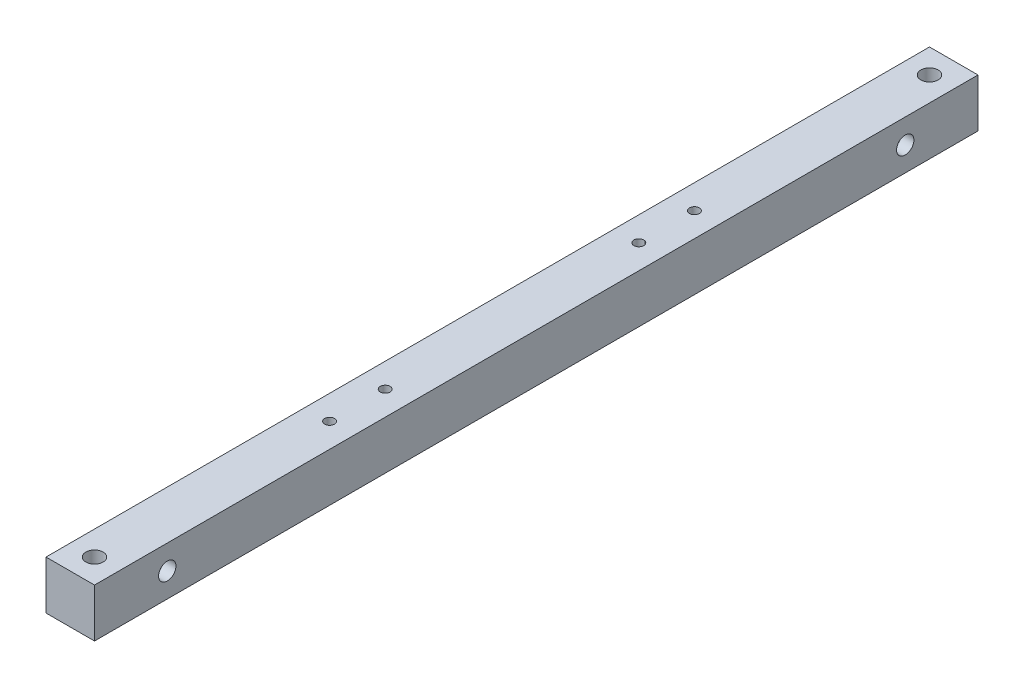
ISO-10303-21;
HEADER;
FILE_DESCRIPTION(('STEP AP214'),'2;1');
FILE_NAME('part.step','',(''),(''),'','','');
FILE_SCHEMA(('AUTOMOTIVE_DESIGN { 1 0 10303 214 1 1 1 1 }'));
ENDSEC;
DATA;
#1=APPLICATION_CONTEXT('core data for automotive mechanical design processes');
#2=APPLICATION_PROTOCOL_DEFINITION('international standard','automotive_design',2000,#1);
#3=PRODUCT_CONTEXT('',#1,'mechanical');
#4=PRODUCT('Part','Part','',(#3));
#5=PRODUCT_RELATED_PRODUCT_CATEGORY('part','',(#4));
#6=PRODUCT_DEFINITION_FORMATION('','',#4);
#7=PRODUCT_DEFINITION_CONTEXT('part definition',#1,'design');
#8=PRODUCT_DEFINITION('design','',#6,#7);
#9=PRODUCT_DEFINITION_SHAPE('','',#8);
#10=(LENGTH_UNIT() NAMED_UNIT(*) SI_UNIT(.MILLI.,.METRE.));
#11=(NAMED_UNIT(*) PLANE_ANGLE_UNIT() SI_UNIT($,.RADIAN.));
#12=(NAMED_UNIT(*) SI_UNIT($,.STERADIAN.) SOLID_ANGLE_UNIT());
#13=UNCERTAINTY_MEASURE_WITH_UNIT(LENGTH_MEASURE(1.E-05),#10,'distance_accuracy_value','');
#14=(GEOMETRIC_REPRESENTATION_CONTEXT(3) GLOBAL_UNCERTAINTY_ASSIGNED_CONTEXT((#13)) GLOBAL_UNIT_ASSIGNED_CONTEXT((#10,
#11,#12)) REPRESENTATION_CONTEXT('',''));
#15=CARTESIAN_POINT('',(0.,0.,0.));
#16=DIRECTION('',(0.,0.,1.));
#17=DIRECTION('',(1.,0.,0.));
#18=AXIS2_PLACEMENT_3D('',#15,#16,#17);
#19=CARTESIAN_POINT('',(0.,14.001,241.));
#20=DIRECTION('',(0.,-1.,0.));
#21=DIRECTION('',(0.,0.,-1.));
#22=AXIS2_PLACEMENT_3D('',#19,#20,#21);
#23=CYLINDRICAL_SURFACE('',#22,3.);
#24=CARTESIAN_POINT('',(0.,-14.,241.));
#25=DIRECTION('',(0.,-1.,0.));
#26=DIRECTION('',(0.,0.,-1.));
#27=AXIS2_PLACEMENT_3D('',#24,#25,#26);
#28=CIRCLE('',#27,3.);
#29=CARTESIAN_POINT('',(0.,-14.,238.));
#30=VERTEX_POINT('',#29);
#31=EDGE_CURVE('E122',#30,#30,#28,.T.);
#32=ORIENTED_EDGE('',*,*,#31,.T.);
#33=EDGE_LOOP('',(#32));
#34=FACE_BOUND('',#33,.T.);
#35=CARTESIAN_POINT('',(0.,7.,241.));
#36=DIRECTION('',(0.,1.,0.));
#37=DIRECTION('',(0.,0.,1.));
#38=AXIS2_PLACEMENT_3D('',#35,#36,#37);
#39=CIRCLE('',#38,3.);
#40=CARTESIAN_POINT('',(0.,7.,244.));
#41=VERTEX_POINT('',#40);
#42=EDGE_CURVE('E37',#41,#41,#39,.F.);
#43=ORIENTED_EDGE('',*,*,#42,.F.);
#44=EDGE_LOOP('',(#43));
#45=FACE_BOUND('',#44,.T.);
#46=ADVANCED_FACE('F33',(#34,#45),#23,.F.);
#47=CARTESIAN_POINT('',(0.,14.001,-241.));
#48=DIRECTION('',(0.,-1.,0.));
#49=DIRECTION('',(0.,0.,-1.));
#50=AXIS2_PLACEMENT_3D('',#47,#48,#49);
#51=CYLINDRICAL_SURFACE('',#50,3.);
#52=CARTESIAN_POINT('',(0.,-14.,-241.));
#53=DIRECTION('',(0.,-1.,0.));
#54=DIRECTION('',(0.,0.,-1.));
#55=AXIS2_PLACEMENT_3D('',#52,#53,#54);
#56=CIRCLE('',#55,3.);
#57=CARTESIAN_POINT('',(0.,-14.,-244.));
#58=VERTEX_POINT('',#57);
#59=EDGE_CURVE('E141',#58,#58,#56,.T.);
#60=ORIENTED_EDGE('',*,*,#59,.T.);
#61=EDGE_LOOP('',(#60));
#62=FACE_BOUND('',#61,.T.);
#63=CARTESIAN_POINT('',(0.,7.,-241.));
#64=DIRECTION('',(0.,1.,0.));
#65=DIRECTION('',(0.,0.,1.));
#66=AXIS2_PLACEMENT_3D('',#63,#64,#65);
#67=CIRCLE('',#66,3.);
#68=CARTESIAN_POINT('',(0.,7.,-238.));
#69=VERTEX_POINT('',#68);
#70=EDGE_CURVE('E116',#69,#69,#67,.F.);
#71=ORIENTED_EDGE('',*,*,#70,.F.);
#72=EDGE_LOOP('',(#71));
#73=FACE_BOUND('',#72,.T.);
#74=ADVANCED_FACE('F166',(#62,#73),#51,.F.);
#75=CARTESIAN_POINT('',(14.,-14.,255.));
#76=DIRECTION('',(-1.,0.,0.));
#77=DIRECTION('',(0.,0.,1.));
#78=AXIS2_PLACEMENT_3D('',#75,#76,#77);
#79=PLANE('',#78);
#80=CARTESIAN_POINT('',(14.,0.,213.));
#81=DIRECTION('',(1.,0.,0.));
#82=DIRECTION('',(0.,0.,-1.));
#83=AXIS2_PLACEMENT_3D('',#80,#81,#82);
#84=CIRCLE('',#83,5.00000000000005);
#85=CARTESIAN_POINT('',(14.,0.,208.));
#86=VERTEX_POINT('',#85);
#87=EDGE_CURVE('E153',#86,#86,#84,.T.);
#88=ORIENTED_EDGE('',*,*,#87,.F.);
#89=EDGE_LOOP('',(#88));
#90=FACE_BOUND('',#89,.T.);
#91=CARTESIAN_POINT('',(14.,0.,-213.));
#92=DIRECTION('',(1.,0.,0.));
#93=DIRECTION('',(0.,0.,-1.));
#94=AXIS2_PLACEMENT_3D('',#91,#92,#93);
#95=CIRCLE('',#94,4.99999999999999);
#96=CARTESIAN_POINT('',(14.,0.,-218.));
#97=VERTEX_POINT('',#96);
#98=EDGE_CURVE('E115',#97,#97,#95,.T.);
#99=ORIENTED_EDGE('',*,*,#98,.F.);
#100=EDGE_LOOP('',(#99));
#101=FACE_BOUND('',#100,.T.);
#102=DIRECTION('',(0.,1.,0.));
#103=VECTOR('',#102,1.);
#104=CARTESIAN_POINT('',(14.,-14.,-255.));
#105=LINE('',#104,#103);
#106=CARTESIAN_POINT('',(14.,-14.,-255.));
#107=VERTEX_POINT('',#106);
#108=CARTESIAN_POINT('',(14.,14.,-255.));
#109=VERTEX_POINT('',#108);
#110=EDGE_CURVE('E100',#107,#109,#105,.T.);
#111=ORIENTED_EDGE('',*,*,#110,.T.);
#112=DIRECTION('',(0.,0.,-1.));
#113=VECTOR('',#112,1.);
#114=CARTESIAN_POINT('',(14.,14.,255.));
#115=LINE('',#114,#113);
#116=CARTESIAN_POINT('',(14.,14.,255.));
#117=VERTEX_POINT('',#116);
#118=EDGE_CURVE('E11',#117,#109,#115,.T.);
#119=ORIENTED_EDGE('',*,*,#118,.F.);
#120=DIRECTION('',(0.,1.,0.));
#121=VECTOR('',#120,1.);
#122=CARTESIAN_POINT('',(14.,-14.,255.));
#123=LINE('',#122,#121);
#124=CARTESIAN_POINT('',(14.,-14.,255.));
#125=VERTEX_POINT('',#124);
#126=EDGE_CURVE('E87',#125,#117,#123,.T.);
#127=ORIENTED_EDGE('',*,*,#126,.F.);
#128=DIRECTION('',(0.,0.,-1.));
#129=VECTOR('',#128,1.);
#130=CARTESIAN_POINT('',(14.,-14.,255.));
#131=LINE('',#130,#129);
#132=EDGE_CURVE('E96',#125,#107,#131,.T.);
#133=ORIENTED_EDGE('',*,*,#132,.T.);
#134=EDGE_LOOP('',(#111,#119,#127,#133));
#135=FACE_BOUND('',#134,.T.);
#136=ADVANCED_FACE('F35',(#90,#101,#135),#79,.F.);
#137=CARTESIAN_POINT('',(-14.,14.,255.));
#138=DIRECTION('',(0.,-1.,0.));
#139=DIRECTION('',(0.,0.,-1.));
#140=AXIS2_PLACEMENT_3D('',#137,#138,#139);
#141=PLANE('',#140);
#142=CARTESIAN_POINT('',(0.,14.,105.3));
#143=DIRECTION('',(0.,1.,0.));
#144=DIRECTION('',(0.,0.,1.));
#145=AXIS2_PLACEMENT_3D('',#142,#143,#144);
#146=CIRCLE('',#145,2.85);
#147=CARTESIAN_POINT('',(0.,14.,108.15));
#148=VERTEX_POINT('',#147);
#149=EDGE_CURVE('E237',#148,#148,#146,.T.);
#150=ORIENTED_EDGE('',*,*,#149,.F.);
#151=EDGE_LOOP('',(#150));
#152=FACE_BOUND('',#151,.T.);
#153=CARTESIAN_POINT('',(0.,14.,73.2));
#154=DIRECTION('',(0.,1.,0.));
#155=DIRECTION('',(0.,0.,1.));
#156=AXIS2_PLACEMENT_3D('',#153,#154,#155);
#157=CIRCLE('',#156,2.85);
#158=CARTESIAN_POINT('',(0.,14.,76.05));
#159=VERTEX_POINT('',#158);
#160=EDGE_CURVE('E241',#159,#159,#157,.T.);
#161=ORIENTED_EDGE('',*,*,#160,.F.);
#162=EDGE_LOOP('',(#161));
#163=FACE_BOUND('',#162,.T.);
#164=CARTESIAN_POINT('',(0.,14.,-73.2));
#165=DIRECTION('',(0.,1.,0.));
#166=DIRECTION('',(0.,0.,-1.));
#167=AXIS2_PLACEMENT_3D('',#164,#165,#166);
#168=CIRCLE('',#167,2.85);
#169=CARTESIAN_POINT('',(0.,14.,-76.05));
#170=VERTEX_POINT('',#169);
#171=EDGE_CURVE('E245',#170,#170,#168,.T.);
#172=ORIENTED_EDGE('',*,*,#171,.F.);
#173=EDGE_LOOP('',(#172));
#174=FACE_BOUND('',#173,.T.);
#175=CARTESIAN_POINT('',(0.,14.,-105.3));
#176=DIRECTION('',(0.,1.,0.));
#177=DIRECTION('',(0.,0.,-1.));
#178=AXIS2_PLACEMENT_3D('',#175,#176,#177);
#179=CIRCLE('',#178,2.85);
#180=CARTESIAN_POINT('',(0.,14.,-108.15));
#181=VERTEX_POINT('',#180);
#182=EDGE_CURVE('E132',#181,#181,#179,.T.);
#183=ORIENTED_EDGE('',*,*,#182,.F.);
#184=EDGE_LOOP('',(#183));
#185=FACE_BOUND('',#184,.T.);
#186=CARTESIAN_POINT('',(0.,14.,241.));
#187=DIRECTION('',(0.,1.,0.));
#188=DIRECTION('',(0.,0.,1.));
#189=AXIS2_PLACEMENT_3D('',#186,#187,#188);
#190=CIRCLE('',#189,5.00000000000001);
#191=CARTESIAN_POINT('',(0.,14.,246.));
#192=VERTEX_POINT('',#191);
#193=EDGE_CURVE('E124',#192,#192,#190,.T.);
#194=ORIENTED_EDGE('',*,*,#193,.F.);
#195=EDGE_LOOP('',(#194));
#196=FACE_BOUND('',#195,.T.);
#197=CARTESIAN_POINT('',(0.,14.,-241.));
#198=DIRECTION('',(0.,1.,0.));
#199=DIRECTION('',(0.,0.,1.));
#200=AXIS2_PLACEMENT_3D('',#197,#198,#199);
#201=CIRCLE('',#200,5.00000000000001);
#202=CARTESIAN_POINT('',(0.,14.,-236.));
#203=VERTEX_POINT('',#202);
#204=EDGE_CURVE('E137',#203,#203,#201,.T.);
#205=ORIENTED_EDGE('',*,*,#204,.F.);
#206=EDGE_LOOP('',(#205));
#207=FACE_BOUND('',#206,.T.);
#208=DIRECTION('',(-1.,0.,0.));
#209=VECTOR('',#208,1.);
#210=CARTESIAN_POINT('',(-14.,14.,-255.));
#211=LINE('',#210,#209);
#212=CARTESIAN_POINT('',(-14.,14.,-255.));
#213=VERTEX_POINT('',#212);
#214=EDGE_CURVE('E91',#109,#213,#211,.T.);
#215=ORIENTED_EDGE('',*,*,#214,.T.);
#216=DIRECTION('',(0.,0.,-1.));
#217=VECTOR('',#216,1.);
#218=CARTESIAN_POINT('',(-14.,14.,255.));
#219=LINE('',#218,#217);
#220=CARTESIAN_POINT('',(-14.,14.,255.));
#221=VERTEX_POINT('',#220);
#222=EDGE_CURVE('E43',#221,#213,#219,.T.);
#223=ORIENTED_EDGE('',*,*,#222,.F.);
#224=DIRECTION('',(-1.,0.,0.));
#225=VECTOR('',#224,1.);
#226=CARTESIAN_POINT('',(-14.,14.,255.));
#227=LINE('',#226,#225);
#228=EDGE_CURVE('E82',#117,#221,#227,.T.);
#229=ORIENTED_EDGE('',*,*,#228,.F.);
#230=ORIENTED_EDGE('',*,*,#118,.T.);
#231=EDGE_LOOP('',(#215,#223,#229,#230));
#232=FACE_BOUND('',#231,.T.);
#233=ADVANCED_FACE('F90',(#152,#163,#174,#185,#196,#207,#232),#141,.F.);
#234=CARTESIAN_POINT('',(-14.,-14.,255.));
#235=DIRECTION('',(1.,0.,0.));
#236=DIRECTION('',(0.,0.,-1.));
#237=AXIS2_PLACEMENT_3D('',#234,#235,#236);
#238=PLANE('',#237);
#239=CARTESIAN_POINT('',(-14.,0.,213.));
#240=DIRECTION('',(1.,0.,0.));
#241=DIRECTION('',(0.,0.,-1.));
#242=AXIS2_PLACEMENT_3D('',#239,#240,#241);
#243=CIRCLE('',#242,3.00000000000005);
#244=CARTESIAN_POINT('',(-14.,0.,210.));
#245=VERTEX_POINT('',#244);
#246=EDGE_CURVE('E113',#245,#245,#243,.T.);
#247=ORIENTED_EDGE('',*,*,#246,.T.);
#248=EDGE_LOOP('',(#247));
#249=FACE_BOUND('',#248,.T.);
#250=CARTESIAN_POINT('',(-14.,0.,-213.));
#251=DIRECTION('',(1.,0.,0.));
#252=DIRECTION('',(0.,0.,-1.));
#253=AXIS2_PLACEMENT_3D('',#250,#251,#252);
#254=CIRCLE('',#253,2.99999999999999);
#255=CARTESIAN_POINT('',(-14.,0.,-216.));
#256=VERTEX_POINT('',#255);
#257=EDGE_CURVE('E144',#256,#256,#254,.T.);
#258=ORIENTED_EDGE('',*,*,#257,.T.);
#259=EDGE_LOOP('',(#258));
#260=FACE_BOUND('',#259,.T.);
#261=DIRECTION('',(0.,-1.,0.));
#262=VECTOR('',#261,1.);
#263=CARTESIAN_POINT('',(-14.,-14.,-255.));
#264=LINE('',#263,#262);
#265=CARTESIAN_POINT('',(-14.,-14.,-255.));
#266=VERTEX_POINT('',#265);
#267=EDGE_CURVE('E69',#213,#266,#264,.T.);
#268=ORIENTED_EDGE('',*,*,#267,.T.);
#269=DIRECTION('',(0.,0.,-1.));
#270=VECTOR('',#269,1.);
#271=CARTESIAN_POINT('',(-14.,-14.,255.));
#272=LINE('',#271,#270);
#273=CARTESIAN_POINT('',(-14.,-14.,255.));
#274=VERTEX_POINT('',#273);
#275=EDGE_CURVE('E92',#274,#266,#272,.T.);
#276=ORIENTED_EDGE('',*,*,#275,.F.);
#277=DIRECTION('',(0.,-1.,0.));
#278=VECTOR('',#277,1.);
#279=CARTESIAN_POINT('',(-14.,-14.,255.));
#280=LINE('',#279,#278);
#281=EDGE_CURVE('E85',#221,#274,#280,.T.);
#282=ORIENTED_EDGE('',*,*,#281,.F.);
#283=ORIENTED_EDGE('',*,*,#222,.T.);
#284=EDGE_LOOP('',(#268,#276,#282,#283));
#285=FACE_BOUND('',#284,.T.);
#286=ADVANCED_FACE('F94',(#249,#260,#285),#238,.F.);
#287=CARTESIAN_POINT('',(-14.,-14.,255.));
#288=DIRECTION('',(0.,1.,0.));
#289=DIRECTION('',(0.,0.,1.));
#290=AXIS2_PLACEMENT_3D('',#287,#288,#289);
#291=PLANE('',#290);
#292=CARTESIAN_POINT('',(0.,-14.,105.3));
#293=DIRECTION('',(0.,1.,0.));
#294=DIRECTION('',(0.,0.,1.));
#295=AXIS2_PLACEMENT_3D('',#292,#293,#294);
#296=CIRCLE('',#295,2.85);
#297=CARTESIAN_POINT('',(0.,-14.,108.15));
#298=VERTEX_POINT('',#297);
#299=EDGE_CURVE('E140',#298,#298,#296,.T.);
#300=ORIENTED_EDGE('',*,*,#299,.T.);
#301=EDGE_LOOP('',(#300));
#302=FACE_BOUND('',#301,.T.);
#303=CARTESIAN_POINT('',(0.,-14.,73.2));
#304=DIRECTION('',(0.,1.,0.));
#305=DIRECTION('',(0.,0.,1.));
#306=AXIS2_PLACEMENT_3D('',#303,#304,#305);
#307=CIRCLE('',#306,2.85);
#308=CARTESIAN_POINT('',(0.,-14.,76.05));
#309=VERTEX_POINT('',#308);
#310=EDGE_CURVE('E290',#309,#309,#307,.T.);
#311=ORIENTED_EDGE('',*,*,#310,.T.);
#312=EDGE_LOOP('',(#311));
#313=FACE_BOUND('',#312,.T.);
#314=CARTESIAN_POINT('',(0.,-14.,-73.2));
#315=DIRECTION('',(0.,1.,0.));
#316=DIRECTION('',(0.,0.,-1.));
#317=AXIS2_PLACEMENT_3D('',#314,#315,#316);
#318=CIRCLE('',#317,2.85);
#319=CARTESIAN_POINT('',(0.,-14.,-76.05));
#320=VERTEX_POINT('',#319);
#321=EDGE_CURVE('E297',#320,#320,#318,.T.);
#322=ORIENTED_EDGE('',*,*,#321,.T.);
#323=EDGE_LOOP('',(#322));
#324=FACE_BOUND('',#323,.T.);
#325=CARTESIAN_POINT('',(0.,-14.,-105.3));
#326=DIRECTION('',(0.,1.,0.));
#327=DIRECTION('',(0.,0.,-1.));
#328=AXIS2_PLACEMENT_3D('',#325,#326,#327);
#329=CIRCLE('',#328,2.85);
#330=CARTESIAN_POINT('',(0.,-14.,-108.15));
#331=VERTEX_POINT('',#330);
#332=EDGE_CURVE('E300',#331,#331,#329,.T.);
#333=ORIENTED_EDGE('',*,*,#332,.T.);
#334=EDGE_LOOP('',(#333));
#335=FACE_BOUND('',#334,.T.);
#336=ORIENTED_EDGE('',*,*,#59,.F.);
#337=EDGE_LOOP('',(#336));
#338=FACE_BOUND('',#337,.T.);
#339=ORIENTED_EDGE('',*,*,#31,.F.);
#340=EDGE_LOOP('',(#339));
#341=FACE_BOUND('',#340,.T.);
#342=DIRECTION('',(1.,0.,0.));
#343=VECTOR('',#342,1.);
#344=CARTESIAN_POINT('',(-14.,-14.,-255.));
#345=LINE('',#344,#343);
#346=EDGE_CURVE('E75',#266,#107,#345,.T.);
#347=ORIENTED_EDGE('',*,*,#346,.T.);
#348=ORIENTED_EDGE('',*,*,#132,.F.);
#349=DIRECTION('',(1.,0.,0.));
#350=VECTOR('',#349,1.);
#351=CARTESIAN_POINT('',(-14.,-14.,255.));
#352=LINE('',#351,#350);
#353=EDGE_CURVE('E52',#274,#125,#352,.T.);
#354=ORIENTED_EDGE('',*,*,#353,.F.);
#355=ORIENTED_EDGE('',*,*,#275,.T.);
#356=EDGE_LOOP('',(#347,#348,#354,#355));
#357=FACE_BOUND('',#356,.T.);
#358=ADVANCED_FACE('F180',(#302,#313,#324,#335,#338,#341,#357),#291,.F.);
#359=CARTESIAN_POINT('',(0.,0.,255.));
#360=DIRECTION('',(0.,0.,-1.));
#361=DIRECTION('',(-1.,0.,0.));
#362=AXIS2_PLACEMENT_3D('',#359,#360,#361);
#363=PLANE('',#362);
#364=ORIENTED_EDGE('',*,*,#126,.T.);
#365=ORIENTED_EDGE('',*,*,#228,.T.);
#366=ORIENTED_EDGE('',*,*,#281,.T.);
#367=ORIENTED_EDGE('',*,*,#353,.T.);
#368=EDGE_LOOP('',(#364,#365,#366,#367));
#369=FACE_BOUND('',#368,.T.);
#370=ADVANCED_FACE('F83',(#369),#363,.F.);
#371=CARTESIAN_POINT('',(0.,0.,-255.));
#372=DIRECTION('',(0.,0.,-1.));
#373=DIRECTION('',(-1.,0.,0.));
#374=AXIS2_PLACEMENT_3D('',#371,#372,#373);
#375=PLANE('',#374);
#376=ORIENTED_EDGE('',*,*,#110,.F.);
#377=ORIENTED_EDGE('',*,*,#346,.F.);
#378=ORIENTED_EDGE('',*,*,#267,.F.);
#379=ORIENTED_EDGE('',*,*,#214,.F.);
#380=EDGE_LOOP('',(#376,#377,#378,#379));
#381=FACE_BOUND('',#380,.T.);
#382=ADVANCED_FACE('F170',(#381),#375,.T.);
#383=CARTESIAN_POINT('',(7.,0.,-213.));
#384=DIRECTION('',(1.,0.,0.));
#385=DIRECTION('',(0.,0.,-1.));
#386=AXIS2_PLACEMENT_3D('',#383,#384,#385);
#387=CYLINDRICAL_SURFACE('',#386,4.99999999999999);
#388=CARTESIAN_POINT('',(7.,0.,-213.));
#389=DIRECTION('',(1.,0.,0.));
#390=DIRECTION('',(0.,0.,-1.));
#391=AXIS2_PLACEMENT_3D('',#388,#389,#390);
#392=CIRCLE('',#391,4.99999999999999);
#393=CARTESIAN_POINT('',(7.,0.,-218.));
#394=VERTEX_POINT('',#393);
#395=EDGE_CURVE('E156',#394,#394,#392,.T.);
#396=ORIENTED_EDGE('',*,*,#395,.F.);
#397=EDGE_LOOP('',(#396));
#398=FACE_BOUND('',#397,.T.);
#399=ORIENTED_EDGE('',*,*,#98,.T.);
#400=EDGE_LOOP('',(#399));
#401=FACE_BOUND('',#400,.T.);
#402=ADVANCED_FACE('F162',(#398,#401),#387,.F.);
#403=CARTESIAN_POINT('',(7.,0.,-213.));
#404=DIRECTION('',(1.,0.,0.));
#405=DIRECTION('',(0.,0.,-1.));
#406=AXIS2_PLACEMENT_3D('',#403,#404,#405);
#407=PLANE('',#406);
#408=CARTESIAN_POINT('',(7.,0.,-213.));
#409=DIRECTION('',(1.,0.,0.));
#410=DIRECTION('',(0.,0.,-1.));
#411=AXIS2_PLACEMENT_3D('',#408,#409,#410);
#412=CIRCLE('',#411,2.99999999999999);
#413=CARTESIAN_POINT('',(7.,0.,-216.));
#414=VERTEX_POINT('',#413);
#415=EDGE_CURVE('E112',#414,#414,#412,.T.);
#416=ORIENTED_EDGE('',*,*,#415,.F.);
#417=EDGE_LOOP('',(#416));
#418=FACE_BOUND('',#417,.T.);
#419=ORIENTED_EDGE('',*,*,#395,.T.);
#420=EDGE_LOOP('',(#419));
#421=FACE_BOUND('',#420,.T.);
#422=ADVANCED_FACE('F177',(#418,#421),#407,.T.);
#423=CARTESIAN_POINT('',(7.,0.,213.));
#424=DIRECTION('',(1.,0.,0.));
#425=DIRECTION('',(0.,0.,-1.));
#426=AXIS2_PLACEMENT_3D('',#423,#424,#425);
#427=CYLINDRICAL_SURFACE('',#426,5.00000000000005);
#428=CARTESIAN_POINT('',(7.,0.,213.));
#429=DIRECTION('',(1.,0.,0.));
#430=DIRECTION('',(0.,0.,-1.));
#431=AXIS2_PLACEMENT_3D('',#428,#429,#430);
#432=CIRCLE('',#431,5.00000000000005);
#433=CARTESIAN_POINT('',(7.,0.,208.));
#434=VERTEX_POINT('',#433);
#435=EDGE_CURVE('E103',#434,#434,#432,.T.);
#436=ORIENTED_EDGE('',*,*,#435,.F.);
#437=EDGE_LOOP('',(#436));
#438=FACE_BOUND('',#437,.T.);
#439=ORIENTED_EDGE('',*,*,#87,.T.);
#440=EDGE_LOOP('',(#439));
#441=FACE_BOUND('',#440,.T.);
#442=ADVANCED_FACE('F206',(#438,#441),#427,.F.);
#443=CARTESIAN_POINT('',(7.,0.,213.));
#444=DIRECTION('',(1.,0.,0.));
#445=DIRECTION('',(0.,0.,-1.));
#446=AXIS2_PLACEMENT_3D('',#443,#444,#445);
#447=PLANE('',#446);
#448=CARTESIAN_POINT('',(7.,0.,213.));
#449=DIRECTION('',(1.,0.,0.));
#450=DIRECTION('',(0.,0.,-1.));
#451=AXIS2_PLACEMENT_3D('',#448,#449,#450);
#452=CIRCLE('',#451,3.00000000000005);
#453=CARTESIAN_POINT('',(7.,0.,210.));
#454=VERTEX_POINT('',#453);
#455=EDGE_CURVE('E109',#454,#454,#452,.T.);
#456=ORIENTED_EDGE('',*,*,#455,.F.);
#457=EDGE_LOOP('',(#456));
#458=FACE_BOUND('',#457,.T.);
#459=ORIENTED_EDGE('',*,*,#435,.T.);
#460=EDGE_LOOP('',(#459));
#461=FACE_BOUND('',#460,.T.);
#462=ADVANCED_FACE('F198',(#458,#461),#447,.T.);
#463=CARTESIAN_POINT('',(-14.,0.,213.));
#464=DIRECTION('',(1.,0.,0.));
#465=DIRECTION('',(0.,0.,-1.));
#466=AXIS2_PLACEMENT_3D('',#463,#464,#465);
#467=CYLINDRICAL_SURFACE('',#466,3.00000000000005);
#468=ORIENTED_EDGE('',*,*,#455,.T.);
#469=EDGE_LOOP('',(#468));
#470=FACE_BOUND('',#469,.T.);
#471=ORIENTED_EDGE('',*,*,#246,.F.);
#472=EDGE_LOOP('',(#471));
#473=FACE_BOUND('',#472,.T.);
#474=ADVANCED_FACE('F194',(#470,#473),#467,.F.);
#475=CARTESIAN_POINT('',(-14.,0.,-213.));
#476=DIRECTION('',(1.,0.,0.));
#477=DIRECTION('',(0.,0.,-1.));
#478=AXIS2_PLACEMENT_3D('',#475,#476,#477);
#479=CYLINDRICAL_SURFACE('',#478,2.99999999999999);
#480=ORIENTED_EDGE('',*,*,#415,.T.);
#481=EDGE_LOOP('',(#480));
#482=FACE_BOUND('',#481,.T.);
#483=ORIENTED_EDGE('',*,*,#257,.F.);
#484=EDGE_LOOP('',(#483));
#485=FACE_BOUND('',#484,.T.);
#486=ADVANCED_FACE('F197',(#482,#485),#479,.F.);
#487=CARTESIAN_POINT('',(0.,7.,-241.));
#488=DIRECTION('',(0.,1.,0.));
#489=DIRECTION('',(0.,0.,1.));
#490=AXIS2_PLACEMENT_3D('',#487,#488,#489);
#491=PLANE('',#490);
#492=CARTESIAN_POINT('',(0.,7.,-241.));
#493=DIRECTION('',(0.,1.,0.));
#494=DIRECTION('',(0.,0.,1.));
#495=AXIS2_PLACEMENT_3D('',#492,#493,#494);
#496=CIRCLE('',#495,5.00000000000001);
#497=CARTESIAN_POINT('',(0.,7.,-236.));
#498=VERTEX_POINT('',#497);
#499=EDGE_CURVE('E129',#498,#498,#496,.T.);
#500=ORIENTED_EDGE('',*,*,#499,.T.);
#501=EDGE_LOOP('',(#500));
#502=FACE_BOUND('',#501,.T.);
#503=ORIENTED_EDGE('',*,*,#70,.T.);
#504=EDGE_LOOP('',(#503));
#505=FACE_BOUND('',#504,.T.);
#506=ADVANCED_FACE('F202',(#502,#505),#491,.T.);
#507=CARTESIAN_POINT('',(0.,7.,-241.));
#508=DIRECTION('',(0.,1.,0.));
#509=DIRECTION('',(0.,0.,1.));
#510=AXIS2_PLACEMENT_3D('',#507,#508,#509);
#511=CYLINDRICAL_SURFACE('',#510,5.00000000000001);
#512=ORIENTED_EDGE('',*,*,#499,.F.);
#513=EDGE_LOOP('',(#512));
#514=FACE_BOUND('',#513,.T.);
#515=ORIENTED_EDGE('',*,*,#204,.T.);
#516=EDGE_LOOP('',(#515));
#517=FACE_BOUND('',#516,.T.);
#518=ADVANCED_FACE('F253',(#514,#517),#511,.F.);
#519=CARTESIAN_POINT('',(0.,7.,241.));
#520=DIRECTION('',(0.,1.,0.));
#521=DIRECTION('',(0.,0.,1.));
#522=AXIS2_PLACEMENT_3D('',#519,#520,#521);
#523=PLANE('',#522);
#524=CARTESIAN_POINT('',(0.,7.,241.));
#525=DIRECTION('',(0.,1.,0.));
#526=DIRECTION('',(0.,0.,1.));
#527=AXIS2_PLACEMENT_3D('',#524,#525,#526);
#528=CIRCLE('',#527,5.00000000000001);
#529=CARTESIAN_POINT('',(0.,7.,246.));
#530=VERTEX_POINT('',#529);
#531=EDGE_CURVE('E118',#530,#530,#528,.T.);
#532=ORIENTED_EDGE('',*,*,#531,.T.);
#533=EDGE_LOOP('',(#532));
#534=FACE_BOUND('',#533,.T.);
#535=ORIENTED_EDGE('',*,*,#42,.T.);
#536=EDGE_LOOP('',(#535));
#537=FACE_BOUND('',#536,.T.);
#538=ADVANCED_FACE('F255',(#534,#537),#523,.T.);
#539=CARTESIAN_POINT('',(0.,7.,241.));
#540=DIRECTION('',(0.,1.,0.));
#541=DIRECTION('',(0.,0.,1.));
#542=AXIS2_PLACEMENT_3D('',#539,#540,#541);
#543=CYLINDRICAL_SURFACE('',#542,5.00000000000001);
#544=ORIENTED_EDGE('',*,*,#531,.F.);
#545=EDGE_LOOP('',(#544));
#546=FACE_BOUND('',#545,.T.);
#547=ORIENTED_EDGE('',*,*,#193,.T.);
#548=EDGE_LOOP('',(#547));
#549=FACE_BOUND('',#548,.T.);
#550=ADVANCED_FACE('F261',(#546,#549),#543,.F.);
#551=CARTESIAN_POINT('',(0.,-14.,-105.3));
#552=DIRECTION('',(0.,1.,0.));
#553=DIRECTION('',(0.,0.,1.));
#554=AXIS2_PLACEMENT_3D('',#551,#552,#553);
#555=CYLINDRICAL_SURFACE('',#554,2.85);
#556=ORIENTED_EDGE('',*,*,#332,.F.);
#557=EDGE_LOOP('',(#556));
#558=FACE_BOUND('',#557,.T.);
#559=ORIENTED_EDGE('',*,*,#182,.T.);
#560=EDGE_LOOP('',(#559));
#561=FACE_BOUND('',#560,.T.);
#562=ADVANCED_FACE('F268',(#558,#561),#555,.F.);
#563=CARTESIAN_POINT('',(0.,-14.,-73.2));
#564=DIRECTION('',(0.,1.,0.));
#565=DIRECTION('',(0.,0.,1.));
#566=AXIS2_PLACEMENT_3D('',#563,#564,#565);
#567=CYLINDRICAL_SURFACE('',#566,2.85);
#568=ORIENTED_EDGE('',*,*,#321,.F.);
#569=EDGE_LOOP('',(#568));
#570=FACE_BOUND('',#569,.T.);
#571=ORIENTED_EDGE('',*,*,#171,.T.);
#572=EDGE_LOOP('',(#571));
#573=FACE_BOUND('',#572,.T.);
#574=ADVANCED_FACE('F273',(#570,#573),#567,.F.);
#575=CARTESIAN_POINT('',(0.,-14.,73.2));
#576=DIRECTION('',(0.,1.,0.));
#577=DIRECTION('',(0.,0.,1.));
#578=AXIS2_PLACEMENT_3D('',#575,#576,#577);
#579=CYLINDRICAL_SURFACE('',#578,2.85);
#580=ORIENTED_EDGE('',*,*,#310,.F.);
#581=EDGE_LOOP('',(#580));
#582=FACE_BOUND('',#581,.T.);
#583=ORIENTED_EDGE('',*,*,#160,.T.);
#584=EDGE_LOOP('',(#583));
#585=FACE_BOUND('',#584,.T.);
#586=ADVANCED_FACE('F277',(#582,#585),#579,.F.);
#587=CARTESIAN_POINT('',(0.,-14.,105.3));
#588=DIRECTION('',(0.,1.,0.));
#589=DIRECTION('',(0.,0.,1.));
#590=AXIS2_PLACEMENT_3D('',#587,#588,#589);
#591=CYLINDRICAL_SURFACE('',#590,2.85);
#592=ORIENTED_EDGE('',*,*,#299,.F.);
#593=EDGE_LOOP('',(#592));
#594=FACE_BOUND('',#593,.T.);
#595=ORIENTED_EDGE('',*,*,#149,.T.);
#596=EDGE_LOOP('',(#595));
#597=FACE_BOUND('',#596,.T.);
#598=ADVANCED_FACE('F281',(#594,#597),#591,.F.);
#599=CLOSED_SHELL('',(#46,#74,#136,#233,#286,#358,#370,#382,#402,#422,#442,#462,#474,#486,#506,
#518,#538,#550,#562,#574,#586,#598));
#600=MANIFOLD_SOLID_BREP('B2',#599);
#601=ADVANCED_BREP_SHAPE_REPRESENTATION('',(#18,#600),#14);
#602=SHAPE_DEFINITION_REPRESENTATION(#9,#601);
ENDSEC;
END-ISO-10303-21;
